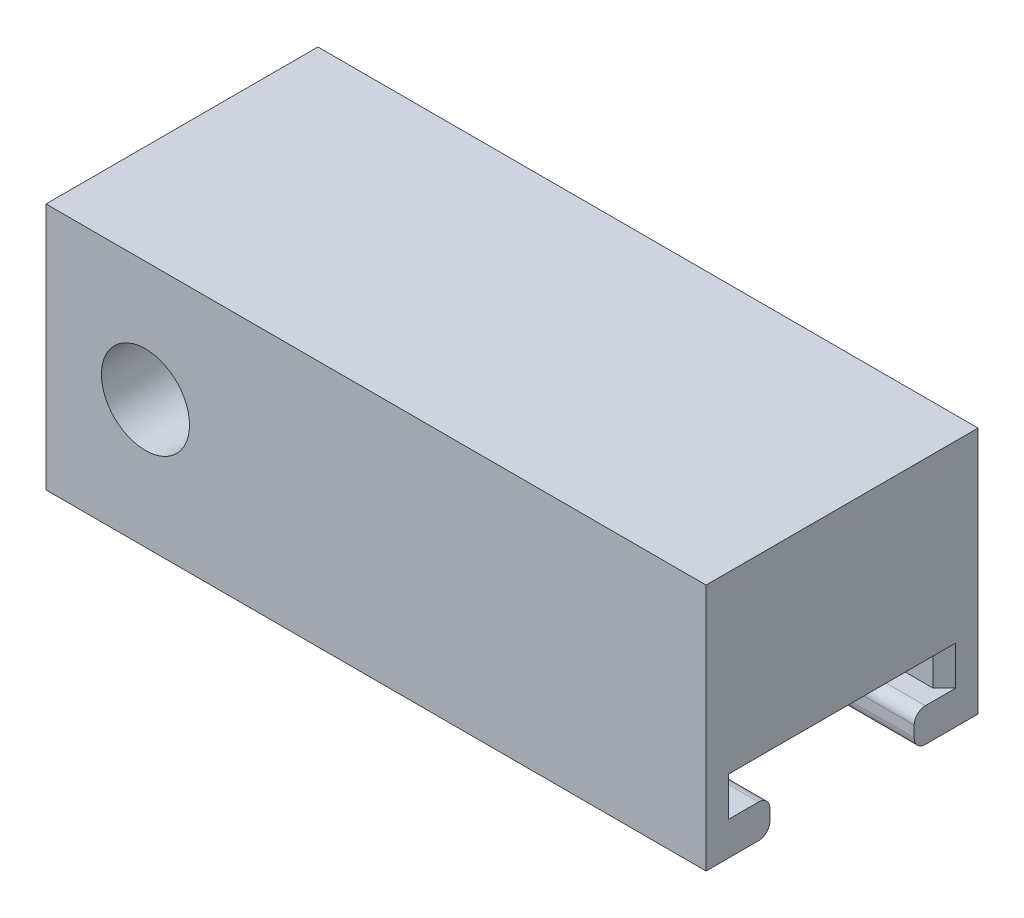
ISO-10303-21;
HEADER;
FILE_DESCRIPTION(('STEP AP214'),'2;1');
FILE_NAME('part.step','',(''),(''),'','','');
FILE_SCHEMA(('AUTOMOTIVE_DESIGN { 1 0 10303 214 1 1 1 1 }'));
ENDSEC;
DATA;
#1=APPLICATION_CONTEXT('core data for automotive mechanical design processes');
#2=APPLICATION_PROTOCOL_DEFINITION('international standard','automotive_design',2000,#1);
#3=PRODUCT_CONTEXT('',#1,'mechanical');
#4=PRODUCT('Part','Part','',(#3));
#5=PRODUCT_RELATED_PRODUCT_CATEGORY('part','',(#4));
#6=PRODUCT_DEFINITION_FORMATION('','',#4);
#7=PRODUCT_DEFINITION_CONTEXT('part definition',#1,'design');
#8=PRODUCT_DEFINITION('design','',#6,#7);
#9=PRODUCT_DEFINITION_SHAPE('','',#8);
#10=(LENGTH_UNIT() NAMED_UNIT(*) SI_UNIT(.MILLI.,.METRE.));
#11=(NAMED_UNIT(*) PLANE_ANGLE_UNIT() SI_UNIT($,.RADIAN.));
#12=(NAMED_UNIT(*) SI_UNIT($,.STERADIAN.) SOLID_ANGLE_UNIT());
#13=UNCERTAINTY_MEASURE_WITH_UNIT(LENGTH_MEASURE(1.E-05),#10,'distance_accuracy_value','');
#14=(GEOMETRIC_REPRESENTATION_CONTEXT(3) GLOBAL_UNCERTAINTY_ASSIGNED_CONTEXT((#13)) GLOBAL_UNIT_ASSIGNED_CONTEXT((#10,
#11,#12)) REPRESENTATION_CONTEXT('',''));
#15=CARTESIAN_POINT('',(0.,0.,0.));
#16=DIRECTION('',(0.,0.,1.));
#17=DIRECTION('',(1.,0.,0.));
#18=AXIS2_PLACEMENT_3D('',#15,#16,#17);
#19=CARTESIAN_POINT('',(11.,-0.46559494542915,3.));
#20=DIRECTION('',(0.,0.,-1.));
#21=DIRECTION('',(-1.,0.,0.));
#22=AXIS2_PLACEMENT_3D('',#19,#20,#21);
#23=CYLINDRICAL_SURFACE('',#22,3.49570965201632);
#24=CARTESIAN_POINT('',(11.,-0.46559494542915,-3.));
#25=DIRECTION('',(0.,0.,-1.));
#26=DIRECTION('',(-1.,0.,0.));
#27=AXIS2_PLACEMENT_3D('',#24,#25,#26);
#28=CIRCLE('',#27,3.49570965201632);
#29=CARTESIAN_POINT('',(13.47184,-2.93743494542916,-3.));
#30=VERTEX_POINT('',#29);
#31=CARTESIAN_POINT('',(8.52816,-2.93743494542916,-3.));
#32=VERTEX_POINT('',#31);
#33=EDGE_CURVE('E85',#30,#32,#28,.T.);
#34=ORIENTED_EDGE('',*,*,#33,.F.);
#35=DIRECTION('',(0.,0.,-1.));
#36=VECTOR('',#35,1.);
#37=CARTESIAN_POINT('',(13.47184,-2.93743494542916,3.));
#38=LINE('',#37,#36);
#39=CARTESIAN_POINT('',(13.47184,-2.93743494542916,3.));
#40=VERTEX_POINT('',#39);
#41=EDGE_CURVE('E12',#40,#30,#38,.T.);
#42=ORIENTED_EDGE('',*,*,#41,.F.);
#43=CARTESIAN_POINT('',(11.,-0.46559494542915,3.));
#44=DIRECTION('',(0.,0.,-1.));
#45=DIRECTION('',(-1.,0.,0.));
#46=AXIS2_PLACEMENT_3D('',#43,#44,#45);
#47=CIRCLE('',#46,3.49570965201632);
#48=CARTESIAN_POINT('',(8.52816,-2.93743494542916,3.));
#49=VERTEX_POINT('',#48);
#50=EDGE_CURVE('E89',#40,#49,#47,.T.);
#51=ORIENTED_EDGE('',*,*,#50,.T.);
#52=DIRECTION('',(0.,0.,-1.));
#53=VECTOR('',#52,1.);
#54=CARTESIAN_POINT('',(8.52816,-2.93743494542916,3.));
#55=LINE('',#54,#53);
#56=EDGE_CURVE('E59',#49,#32,#55,.T.);
#57=ORIENTED_EDGE('',*,*,#56,.T.);
#58=EDGE_LOOP('',(#34,#42,#51,#57));
#59=FACE_BOUND('',#58,.T.);
#60=ADVANCED_FACE('F56',(#59),#23,.T.);
#61=CARTESIAN_POINT('',(8.52816,-2.93743494542916,3.));
#62=DIRECTION('',(0.,1.,0.));
#63=DIRECTION('',(-1.,0.,0.));
#64=AXIS2_PLACEMENT_3D('',#61,#62,#63);
#65=PLANE('',#64);
#66=DIRECTION('',(1.,0.,0.));
#67=VECTOR('',#66,1.);
#68=CARTESIAN_POINT('',(8.52816,-2.93743494542916,-3.));
#69=LINE('',#68,#67);
#70=EDGE_CURVE('E82',#32,#30,#69,.T.);
#71=ORIENTED_EDGE('',*,*,#70,.F.);
#72=ORIENTED_EDGE('',*,*,#56,.F.);
#73=DIRECTION('',(1.,0.,0.));
#74=VECTOR('',#73,1.);
#75=CARTESIAN_POINT('',(8.52816,-2.93743494542916,3.));
#76=LINE('',#75,#74);
#77=EDGE_CURVE('E84',#49,#40,#76,.T.);
#78=ORIENTED_EDGE('',*,*,#77,.T.);
#79=ORIENTED_EDGE('',*,*,#41,.T.);
#80=EDGE_LOOP('',(#71,#72,#78,#79));
#81=FACE_BOUND('',#80,.T.);
#82=ADVANCED_FACE('F80',(#81),#65,.T.);
#83=CARTESIAN_POINT('',(11.,-0.46559494542915,3.));
#84=DIRECTION('',(0.,0.,-1.));
#85=DIRECTION('',(-1.,0.,0.));
#86=AXIS2_PLACEMENT_3D('',#83,#84,#85);
#87=PLANE('',#86);
#88=ORIENTED_EDGE('',*,*,#50,.F.);
#89=ORIENTED_EDGE('',*,*,#77,.F.);
#90=EDGE_LOOP('',(#88,#89));
#91=FACE_BOUND('',#90,.T.);
#92=ADVANCED_FACE('F94',(#91),#87,.F.);
#93=CARTESIAN_POINT('',(11.,-0.46559494542915,-3.));
#94=DIRECTION('',(0.,0.,-1.));
#95=DIRECTION('',(-1.,0.,0.));
#96=AXIS2_PLACEMENT_3D('',#93,#94,#95);
#97=PLANE('',#96);
#98=ORIENTED_EDGE('',*,*,#33,.T.);
#99=ORIENTED_EDGE('',*,*,#70,.T.);
#100=EDGE_LOOP('',(#98,#99));
#101=FACE_BOUND('',#100,.T.);
#102=ADVANCED_FACE('F88',(#101),#97,.T.);
#103=CLOSED_SHELL('',(#60,#82,#92,#102));
#104=MANIFOLD_SOLID_BREP('B2',#103);
#105=CARTESIAN_POINT('',(59.,-6.43743494542916,-7.44806819473783));
#106=DIRECTION('',(0.,-1.,0.));
#107=DIRECTION('',(0.,0.,-1.));
#108=AXIS2_PLACEMENT_3D('',#105,#106,#107);
#109=PLANE('',#108);
#110=DIRECTION('',(0.,0.,-1.));
#111=VECTOR('',#110,1.);
#112=CARTESIAN_POINT('',(25.4,-6.43743494542916,-7.44806819473783));
#113=LINE('',#112,#111);
#114=CARTESIAN_POINT('',(25.4,-6.43743494542916,-7.44806819473783));
#115=VERTEX_POINT('',#114);
#116=CARTESIAN_POINT('',(25.4,-6.43743494542916,-9.1519321867319));
#117=VERTEX_POINT('',#116);
#118=EDGE_CURVE('E144',#115,#117,#113,.T.);
#119=ORIENTED_EDGE('',*,*,#118,.F.);
#120=DIRECTION('',(-1.,0.,0.));
#121=VECTOR('',#120,1.);
#122=CARTESIAN_POINT('',(59.,-6.43743494542916,-7.44806819473783));
#123=LINE('',#122,#121);
#124=CARTESIAN_POINT('',(59.,-6.43743494542916,-7.44806819473783));
#125=VERTEX_POINT('',#124);
#126=EDGE_CURVE('E469',#125,#115,#123,.T.);
#127=ORIENTED_EDGE('',*,*,#126,.F.);
#128=DIRECTION('',(0.,0.,1.));
#129=VECTOR('',#128,1.);
#130=CARTESIAN_POINT('',(59.,-6.43743494542916,-7.44806819473783));
#131=LINE('',#130,#129);
#132=CARTESIAN_POINT('',(59.,-6.43743494542916,-10.1519321867319));
#133=VERTEX_POINT('',#132);
#134=EDGE_CURVE('E435',#133,#125,#131,.T.);
#135=ORIENTED_EDGE('',*,*,#134,.F.);
#136=DIRECTION('',(-0.70710678118655,0.,0.707106781186545));
#137=VECTOR('',#136,1.);
#138=CARTESIAN_POINT('',(57.648068004003,-6.43743494542916,-8.80000019073488));
#139=LINE('',#138,#137);
#140=CARTESIAN_POINT('',(58.,-6.43743494542917,-9.1519321867319));
#141=VERTEX_POINT('',#140);
#142=EDGE_CURVE('E137',#133,#141,#139,.T.);
#143=ORIENTED_EDGE('',*,*,#142,.T.);
#144=DIRECTION('',(-1.,0.,0.));
#145=VECTOR('',#144,1.);
#146=CARTESIAN_POINT('',(0.,-6.43743494542916,-9.1519321867319));
#147=LINE('',#146,#145);
#148=EDGE_CURVE('E405',#141,#117,#147,.T.);
#149=ORIENTED_EDGE('',*,*,#148,.T.);
#150=EDGE_LOOP('',(#119,#127,#135,#143,#149));
#151=FACE_BOUND('',#150,.T.);
#152=ADVANCED_FACE('F128',(#151),#109,.F.);
#153=CARTESIAN_POINT('',(59.,-7.43743494542914,-7.44806819473783));
#154=DIRECTION('',(-1.,0.,0.));
#155=DIRECTION('',(0.,0.,1.));
#156=AXIS2_PLACEMENT_3D('',#153,#154,#155);
#157=CYLINDRICAL_SURFACE('',#156,0.999999999999982);
#158=CARTESIAN_POINT('',(25.4,-7.43743494542914,-7.44806819473783));
#159=DIRECTION('',(-1.,0.,0.));
#160=DIRECTION('',(0.,0.,1.));
#161=AXIS2_PLACEMENT_3D('',#158,#159,#160);
#162=CIRCLE('',#161,0.999999999999983);
#163=CARTESIAN_POINT('',(25.4,-7.43743494542914,-6.44806819473785));
#164=VERTEX_POINT('',#163);
#165=EDGE_CURVE('E314',#164,#115,#162,.T.);
#166=ORIENTED_EDGE('',*,*,#165,.F.);
#167=DIRECTION('',(-1.,0.,0.));
#168=VECTOR('',#167,1.);
#169=CARTESIAN_POINT('',(59.,-7.43743494542914,-6.44806819473785));
#170=LINE('',#169,#168);
#171=CARTESIAN_POINT('',(59.,-7.43743494542914,-6.44806819473785));
#172=VERTEX_POINT('',#171);
#173=EDGE_CURVE('E466',#172,#164,#170,.T.);
#174=ORIENTED_EDGE('',*,*,#173,.F.);
#175=CARTESIAN_POINT('',(59.,-7.43743494542914,-7.44806819473783));
#176=DIRECTION('',(1.,0.,0.));
#177=DIRECTION('',(0.,0.,1.));
#178=AXIS2_PLACEMENT_3D('',#175,#176,#177);
#179=CIRCLE('',#178,0.999999999999982);
#180=EDGE_CURVE('E437',#125,#172,#179,.T.);
#181=ORIENTED_EDGE('',*,*,#180,.F.);
#182=ORIENTED_EDGE('',*,*,#126,.T.);
#183=EDGE_LOOP('',(#166,#174,#181,#182));
#184=FACE_BOUND('',#183,.T.);
#185=ADVANCED_FACE('F537',(#184),#157,.T.);
#186=CARTESIAN_POINT('',(59.,-8.43743494525206,-6.44806819473785));
#187=DIRECTION('',(0.,0.,-1.));
#188=DIRECTION('',(-1.,0.,0.));
#189=AXIS2_PLACEMENT_3D('',#186,#187,#188);
#190=PLANE('',#189);
#191=DIRECTION('',(0.,1.,0.));
#192=VECTOR('',#191,1.);
#193=CARTESIAN_POINT('',(25.4,-7.43743494542914,-6.44806819473785));
#194=LINE('',#193,#192);
#195=CARTESIAN_POINT('',(25.4,-8.43743494525206,-6.44806819473785));
#196=VERTEX_POINT('',#195);
#197=EDGE_CURVE('E327',#196,#164,#194,.T.);
#198=ORIENTED_EDGE('',*,*,#197,.F.);
#199=DIRECTION('',(-1.,0.,0.));
#200=VECTOR('',#199,1.);
#201=CARTESIAN_POINT('',(59.,-8.43743494525206,-6.44806819473785));
#202=LINE('',#201,#200);
#203=CARTESIAN_POINT('',(59.,-8.43743494525206,-6.44806819473785));
#204=VERTEX_POINT('',#203);
#205=EDGE_CURVE('E463',#204,#196,#202,.T.);
#206=ORIENTED_EDGE('',*,*,#205,.F.);
#207=DIRECTION('',(0.,-1.,0.));
#208=VECTOR('',#207,1.);
#209=CARTESIAN_POINT('',(59.,-8.43743494525206,-6.44806819473785));
#210=LINE('',#209,#208);
#211=EDGE_CURVE('E439',#172,#204,#210,.T.);
#212=ORIENTED_EDGE('',*,*,#211,.F.);
#213=ORIENTED_EDGE('',*,*,#173,.T.);
#214=EDGE_LOOP('',(#198,#206,#212,#213));
#215=FACE_BOUND('',#214,.T.);
#216=ADVANCED_FACE('F533',(#215),#190,.F.);
#217=CARTESIAN_POINT('',(59.,-8.43743494525206,-7.44806819473793));
#218=DIRECTION('',(-1.,0.,0.));
#219=DIRECTION('',(0.,0.,1.));
#220=AXIS2_PLACEMENT_3D('',#217,#218,#219);
#221=CYLINDRICAL_SURFACE('',#220,1.00000000000008);
#222=CARTESIAN_POINT('',(25.4,-8.43743494525206,-7.44806819473793));
#223=DIRECTION('',(-1.,0.,0.));
#224=DIRECTION('',(0.,0.,1.));
#225=AXIS2_PLACEMENT_3D('',#222,#223,#224);
#226=CIRCLE('',#225,1.00000000000008);
#227=CARTESIAN_POINT('',(25.4,-9.43743494525214,-7.44806819473793));
#228=VERTEX_POINT('',#227);
#229=EDGE_CURVE('E325',#228,#196,#226,.T.);
#230=ORIENTED_EDGE('',*,*,#229,.F.);
#231=DIRECTION('',(-1.,0.,0.));
#232=VECTOR('',#231,1.);
#233=CARTESIAN_POINT('',(59.,-9.43743494525214,-7.44806819473793));
#234=LINE('',#233,#232);
#235=CARTESIAN_POINT('',(59.,-9.43743494525214,-7.44806819473793));
#236=VERTEX_POINT('',#235);
#237=EDGE_CURVE('E324',#236,#228,#234,.T.);
#238=ORIENTED_EDGE('',*,*,#237,.F.);
#239=CARTESIAN_POINT('',(59.,-8.43743494525206,-7.44806819473793));
#240=DIRECTION('',(1.,0.,0.));
#241=DIRECTION('',(0.,0.,1.));
#242=AXIS2_PLACEMENT_3D('',#239,#240,#241);
#243=CIRCLE('',#242,1.00000000000008);
#244=EDGE_CURVE('E441',#204,#236,#243,.T.);
#245=ORIENTED_EDGE('',*,*,#244,.F.);
#246=ORIENTED_EDGE('',*,*,#205,.T.);
#247=EDGE_LOOP('',(#230,#238,#245,#246));
#248=FACE_BOUND('',#247,.T.);
#249=ADVANCED_FACE('F529',(#248),#221,.T.);
#250=CARTESIAN_POINT('',(59.,-9.43743494542915,12.1519321867319));
#251=DIRECTION('',(0.,0.,-1.));
#252=DIRECTION('',(-1.,0.,0.));
#253=AXIS2_PLACEMENT_3D('',#250,#251,#252);
#254=PLANE('',#253);
#255=CARTESIAN_POINT('',(8.88999999999999,1.99694504352777,12.1519321867319));
#256=DIRECTION('',(0.,0.,1.));
#257=DIRECTION('',(1.,0.,0.));
#258=AXIS2_PLACEMENT_3D('',#255,#256,#257);
#259=CIRCLE('',#258,3.93699999999998);
#260=CARTESIAN_POINT('',(12.827,1.99694504352777,12.1519321867319));
#261=VERTEX_POINT('',#260);
#262=EDGE_CURVE('E352',#261,#261,#259,.T.);
#263=ORIENTED_EDGE('',*,*,#262,.F.);
#264=EDGE_LOOP('',(#263));
#265=FACE_BOUND('',#264,.T.);
#266=DIRECTION('',(0.,-1.,0.));
#267=VECTOR('',#266,1.);
#268=CARTESIAN_POINT('',(0.,-9.43743494542915,12.1519321867319));
#269=LINE('',#268,#267);
#270=CARTESIAN_POINT('',(0.,12.7,12.1519321867319));
#271=VERTEX_POINT('',#270);
#272=CARTESIAN_POINT('',(0.,-9.43743494542915,12.1519321867319));
#273=VERTEX_POINT('',#272);
#274=EDGE_CURVE('E419',#271,#273,#269,.T.);
#275=ORIENTED_EDGE('',*,*,#274,.T.);
#276=DIRECTION('',(-1.,0.,0.));
#277=VECTOR('',#276,1.);
#278=CARTESIAN_POINT('',(59.,-9.43743494542915,12.1519321867319));
#279=LINE('',#278,#277);
#280=CARTESIAN_POINT('',(59.,-9.43743494542915,12.1519321867319));
#281=VERTEX_POINT('',#280);
#282=EDGE_CURVE('E484',#281,#273,#279,.T.);
#283=ORIENTED_EDGE('',*,*,#282,.F.);
#284=DIRECTION('',(0.,-1.,0.));
#285=VECTOR('',#284,1.);
#286=CARTESIAN_POINT('',(59.,-9.43743494542915,12.1519321867319));
#287=LINE('',#286,#285);
#288=CARTESIAN_POINT('',(59.,12.7,12.1519321867319));
#289=VERTEX_POINT('',#288);
#290=EDGE_CURVE('E420',#289,#281,#287,.T.);
#291=ORIENTED_EDGE('',*,*,#290,.F.);
#292=DIRECTION('',(1.,0.,0.));
#293=VECTOR('',#292,1.);
#294=CARTESIAN_POINT('',(0.,12.7,12.1519321867319));
#295=LINE('',#294,#293);
#296=EDGE_CURVE('E391',#271,#289,#295,.T.);
#297=ORIENTED_EDGE('',*,*,#296,.F.);
#298=EDGE_LOOP('',(#275,#283,#291,#297));
#299=FACE_BOUND('',#298,.T.);
#300=ADVANCED_FACE('F559',(#265,#299),#254,.F.);
#301=CARTESIAN_POINT('',(59.,-9.43743494542915,7.4519319006296));
#302=DIRECTION('',(0.,1.,0.));
#303=DIRECTION('',(0.,0.,1.));
#304=AXIS2_PLACEMENT_3D('',#301,#302,#303);
#305=PLANE('',#304);
#306=DIRECTION('',(0.,0.,-1.));
#307=VECTOR('',#306,1.);
#308=CARTESIAN_POINT('',(0.,-9.43743494542915,7.4519319006296));
#309=LINE('',#308,#307);
#310=CARTESIAN_POINT('',(0.,-9.43743494525214,9.1519321867319));
#311=VERTEX_POINT('',#310);
#312=EDGE_CURVE('E449',#273,#311,#309,.T.);
#313=ORIENTED_EDGE('',*,*,#312,.T.);
#314=DIRECTION('',(-1.,0.,0.));
#315=VECTOR('',#314,1.);
#316=CARTESIAN_POINT('',(25.4,-9.43743494525214,9.1519321867319));
#317=LINE('',#316,#315);
#318=CARTESIAN_POINT('',(25.4,-9.43743494525214,9.1519321867319));
#319=VERTEX_POINT('',#318);
#320=EDGE_CURVE('E333',#319,#311,#317,.T.);
#321=ORIENTED_EDGE('',*,*,#320,.F.);
#322=DIRECTION('',(0.,0.,1.));
#323=VECTOR('',#322,1.);
#324=CARTESIAN_POINT('',(25.4,-9.43743494525214,9.1519321867319));
#325=LINE('',#324,#323);
#326=CARTESIAN_POINT('',(25.4,-9.43743494525214,7.4519319006296));
#327=VERTEX_POINT('',#326);
#328=EDGE_CURVE('E341',#327,#319,#325,.T.);
#329=ORIENTED_EDGE('',*,*,#328,.F.);
#330=DIRECTION('',(-1.,0.,0.));
#331=VECTOR('',#330,1.);
#332=CARTESIAN_POINT('',(59.,-9.43743494542915,7.4519319006296));
#333=LINE('',#332,#331);
#334=CARTESIAN_POINT('',(59.,-9.43743494542915,7.4519319006296));
#335=VERTEX_POINT('',#334);
#336=EDGE_CURVE('E481',#335,#327,#333,.T.);
#337=ORIENTED_EDGE('',*,*,#336,.F.);
#338=DIRECTION('',(0.,0.,-1.));
#339=VECTOR('',#338,1.);
#340=CARTESIAN_POINT('',(59.,-9.43743494542915,7.4519319006296));
#341=LINE('',#340,#339);
#342=EDGE_CURVE('E422',#281,#335,#341,.T.);
#343=ORIENTED_EDGE('',*,*,#342,.F.);
#344=ORIENTED_EDGE('',*,*,#282,.T.);
#345=EDGE_LOOP('',(#313,#321,#329,#337,#343,#344));
#346=FACE_BOUND('',#345,.T.);
#347=ADVANCED_FACE('F553',(#346),#305,.F.);
#348=CARTESIAN_POINT('',(59.,-8.43743494542916,7.4519319006296));
#349=DIRECTION('',(-1.,0.,0.));
#350=DIRECTION('',(0.,0.,1.));
#351=AXIS2_PLACEMENT_3D('',#348,#349,#350);
#352=CYLINDRICAL_SURFACE('',#351,0.999999999999995);
#353=CARTESIAN_POINT('',(25.4,-9.43743494525214,7.44806819473793));
#354=VERTEX_POINT('',#353);
#355=EDGE_CURVE('E342',#354,#327,#325,.T.);
#356=ORIENTED_EDGE('',*,*,#355,.F.);
#357=CARTESIAN_POINT('',(25.4,-8.43743494542916,7.4519319006296));
#358=DIRECTION('',(1.,0.,0.));
#359=DIRECTION('',(0.,0.,-1.));
#360=AXIS2_PLACEMENT_3D('',#357,#358,#359);
#361=CIRCLE('',#360,0.999999999999995);
#362=CARTESIAN_POINT('',(25.4,-8.43743494542916,6.4519319006296));
#363=VERTEX_POINT('',#362);
#364=EDGE_CURVE('E349',#354,#363,#361,.T.);
#365=ORIENTED_EDGE('',*,*,#364,.T.);
#366=DIRECTION('',(-1.,0.,0.));
#367=VECTOR('',#366,1.);
#368=CARTESIAN_POINT('',(59.,-8.43743494542916,6.4519319006296));
#369=LINE('',#368,#367);
#370=CARTESIAN_POINT('',(59.,-8.43743494542916,6.4519319006296));
#371=VERTEX_POINT('',#370);
#372=EDGE_CURVE('E478',#371,#363,#369,.T.);
#373=ORIENTED_EDGE('',*,*,#372,.F.);
#374=CARTESIAN_POINT('',(59.,-8.43743494542916,7.4519319006296));
#375=DIRECTION('',(1.,0.,0.));
#376=DIRECTION('',(0.,0.,1.));
#377=AXIS2_PLACEMENT_3D('',#374,#375,#376);
#378=CIRCLE('',#377,0.999999999999995);
#379=EDGE_CURVE('E425',#335,#371,#378,.T.);
#380=ORIENTED_EDGE('',*,*,#379,.F.);
#381=ORIENTED_EDGE('',*,*,#336,.T.);
#382=EDGE_LOOP('',(#356,#365,#373,#380,#381));
#383=FACE_BOUND('',#382,.T.);
#384=ADVANCED_FACE('F599',(#383),#352,.T.);
#385=CARTESIAN_POINT('',(59.,-7.43743494542916,6.4519319006296));
#386=DIRECTION('',(0.,0.,1.));
#387=DIRECTION('',(1.,0.,0.));
#388=AXIS2_PLACEMENT_3D('',#385,#386,#387);
#389=PLANE('',#388);
#390=ORIENTED_EDGE('',*,*,#372,.T.);
#391=DIRECTION('',(0.,1.,0.));
#392=VECTOR('',#391,1.);
#393=CARTESIAN_POINT('',(25.4,-7.43743494542916,6.4519319006296));
#394=LINE('',#393,#392);
#395=CARTESIAN_POINT('',(25.4,-7.43743494542916,6.4519319006296));
#396=VERTEX_POINT('',#395);
#397=EDGE_CURVE('E346',#363,#396,#394,.T.);
#398=ORIENTED_EDGE('',*,*,#397,.T.);
#399=DIRECTION('',(-1.,0.,0.));
#400=VECTOR('',#399,1.);
#401=CARTESIAN_POINT('',(59.,-7.43743494542916,6.4519319006296));
#402=LINE('',#401,#400);
#403=CARTESIAN_POINT('',(59.,-7.43743494542916,6.4519319006296));
#404=VERTEX_POINT('',#403);
#405=EDGE_CURVE('E475',#404,#396,#402,.T.);
#406=ORIENTED_EDGE('',*,*,#405,.F.);
#407=DIRECTION('',(0.,1.,0.));
#408=VECTOR('',#407,1.);
#409=CARTESIAN_POINT('',(59.,-7.43743494542916,6.4519319006296));
#410=LINE('',#409,#408);
#411=EDGE_CURVE('E427',#371,#404,#410,.T.);
#412=ORIENTED_EDGE('',*,*,#411,.F.);
#413=EDGE_LOOP('',(#390,#398,#406,#412));
#414=FACE_BOUND('',#413,.T.);
#415=ADVANCED_FACE('F595',(#414),#389,.F.);
#416=CARTESIAN_POINT('',(59.,-7.43743494542916,7.4519319006296));
#417=DIRECTION('',(-1.,0.,0.));
#418=DIRECTION('',(0.,0.,1.));
#419=AXIS2_PLACEMENT_3D('',#416,#417,#418);
#420=CYLINDRICAL_SURFACE('',#419,0.999999999999997);
#421=CARTESIAN_POINT('',(25.4,-7.43743494542916,7.4519319006296));
#422=DIRECTION('',(1.,0.,0.));
#423=DIRECTION('',(0.,0.,-1.));
#424=AXIS2_PLACEMENT_3D('',#421,#422,#423);
#425=CIRCLE('',#424,0.999999999999997);
#426=CARTESIAN_POINT('',(25.4,-6.43743494542916,7.44806819473783));
#427=VERTEX_POINT('',#426);
#428=EDGE_CURVE('E313',#396,#427,#425,.T.);
#429=ORIENTED_EDGE('',*,*,#428,.T.);
#430=DIRECTION('',(0.,0.,-1.));
#431=VECTOR('',#430,1.);
#432=CARTESIAN_POINT('',(25.4,-6.43743494542916,7.44806819473783));
#433=LINE('',#432,#431);
#434=CARTESIAN_POINT('',(25.4,-6.43743494542916,7.4519319006296));
#435=VERTEX_POINT('',#434);
#436=EDGE_CURVE('E336',#435,#427,#433,.T.);
#437=ORIENTED_EDGE('',*,*,#436,.F.);
#438=DIRECTION('',(-1.,0.,0.));
#439=VECTOR('',#438,1.);
#440=CARTESIAN_POINT('',(59.,-6.43743494542916,7.4519319006296));
#441=LINE('',#440,#439);
#442=CARTESIAN_POINT('',(59.,-6.43743494542916,7.4519319006296));
#443=VERTEX_POINT('',#442);
#444=EDGE_CURVE('E472',#443,#435,#441,.T.);
#445=ORIENTED_EDGE('',*,*,#444,.F.);
#446=CARTESIAN_POINT('',(59.,-7.43743494542916,7.4519319006296));
#447=DIRECTION('',(1.,0.,0.));
#448=DIRECTION('',(0.,0.,1.));
#449=AXIS2_PLACEMENT_3D('',#446,#447,#448);
#450=CIRCLE('',#449,0.999999999999997);
#451=EDGE_CURVE('E429',#404,#443,#450,.T.);
#452=ORIENTED_EDGE('',*,*,#451,.F.);
#453=ORIENTED_EDGE('',*,*,#405,.T.);
#454=EDGE_LOOP('',(#429,#437,#445,#452,#453));
#455=FACE_BOUND('',#454,.T.);
#456=ADVANCED_FACE('F591',(#455),#420,.T.);
#457=CARTESIAN_POINT('',(59.,-6.43743494542916,10.1519321867319));
#458=DIRECTION('',(0.,-1.,0.));
#459=DIRECTION('',(0.,0.,-1.));
#460=AXIS2_PLACEMENT_3D('',#457,#458,#459);
#461=PLANE('',#460);
#462=ORIENTED_EDGE('',*,*,#444,.T.);
#463=CARTESIAN_POINT('',(25.4,-6.43743494542916,9.1519321867319));
#464=VERTEX_POINT('',#463);
#465=EDGE_CURVE('E337',#464,#435,#433,.T.);
#466=ORIENTED_EDGE('',*,*,#465,.F.);
#467=DIRECTION('',(-1.,0.,0.));
#468=VECTOR('',#467,1.);
#469=CARTESIAN_POINT('',(0.,-6.43743494542916,9.1519321867319));
#470=LINE('',#469,#468);
#471=CARTESIAN_POINT('',(58.,-6.43743494542917,9.1519321867319));
#472=VERTEX_POINT('',#471);
#473=EDGE_CURVE('E416',#472,#464,#470,.T.);
#474=ORIENTED_EDGE('',*,*,#473,.F.);
#475=DIRECTION('',(0.707106781186548,0.,0.707106781186547));
#476=VECTOR('',#475,1.);
#477=CARTESIAN_POINT('',(59.,-6.43743494542916,10.1519321867319));
#478=LINE('',#477,#476);
#479=CARTESIAN_POINT('',(59.,-6.43743494542916,10.1519321867319));
#480=VERTEX_POINT('',#479);
#481=EDGE_CURVE('E493',#472,#480,#478,.T.);
#482=ORIENTED_EDGE('',*,*,#481,.T.);
#483=DIRECTION('',(0.,0.,1.));
#484=VECTOR('',#483,1.);
#485=CARTESIAN_POINT('',(59.,-6.43743494542916,10.1519321867319));
#486=LINE('',#485,#484);
#487=EDGE_CURVE('E431',#443,#480,#486,.T.);
#488=ORIENTED_EDGE('',*,*,#487,.F.);
#489=EDGE_LOOP('',(#462,#466,#474,#482,#488));
#490=FACE_BOUND('',#489,.T.);
#491=ADVANCED_FACE('F588',(#490),#461,.F.);
#492=CARTESIAN_POINT('',(59.,-2.93743494542916,-10.148068004003));
#493=DIRECTION('',(0.,1.,0.));
#494=DIRECTION('',(0.,0.,1.));
#495=AXIS2_PLACEMENT_3D('',#492,#493,#494);
#496=PLANE('',#495);
#497=DIRECTION('',(0.,0.,-1.));
#498=VECTOR('',#497,1.);
#499=CARTESIAN_POINT('',(0.,-2.93743494542916,-10.148068004003));
#500=LINE('',#499,#498);
#501=CARTESIAN_POINT('',(0.,-2.93743494542916,9.1519321867319));
#502=VERTEX_POINT('',#501);
#503=CARTESIAN_POINT('',(0.,-2.93743494542916,-9.1519321867319));
#504=VERTEX_POINT('',#503);
#505=EDGE_CURVE('E452',#502,#504,#500,.T.);
#506=ORIENTED_EDGE('',*,*,#505,.T.);
#507=DIRECTION('',(1.,0.,0.));
#508=VECTOR('',#507,1.);
#509=CARTESIAN_POINT('',(0.,-2.93743494542915,-9.1519321867319));
#510=LINE('',#509,#508);
#511=CARTESIAN_POINT('',(58.,-2.93743494542916,-9.1519321867319));
#512=VERTEX_POINT('',#511);
#513=EDGE_CURVE('E407',#504,#512,#510,.T.);
#514=ORIENTED_EDGE('',*,*,#513,.T.);
#515=DIRECTION('',(0.70710678118655,0.,-0.707106781186545));
#516=VECTOR('',#515,1.);
#517=CARTESIAN_POINT('',(58.9980679086355,-2.93743494542916,-10.1500000953674));
#518=LINE('',#517,#516);
#519=CARTESIAN_POINT('',(59.,-2.93743494542916,-10.1519321867319));
#520=VERTEX_POINT('',#519);
#521=EDGE_CURVE('E54',#512,#520,#518,.T.);
#522=ORIENTED_EDGE('',*,*,#521,.T.);
#523=DIRECTION('',(0.,0.,-1.));
#524=VECTOR('',#523,1.);
#525=CARTESIAN_POINT('',(59.,-2.93743494542916,-10.148068004003));
#526=LINE('',#525,#524);
#527=CARTESIAN_POINT('',(59.,-2.93743494542916,10.1519321867319));
#528=VERTEX_POINT('',#527);
#529=EDGE_CURVE('E433',#528,#520,#526,.T.);
#530=ORIENTED_EDGE('',*,*,#529,.F.);
#531=DIRECTION('',(-0.707106781186548,0.,-0.707106781186547));
#532=VECTOR('',#531,1.);
#533=CARTESIAN_POINT('',(48.8499999046326,-2.93743494542916,0.00193209136448158));
#534=LINE('',#533,#532);
#535=CARTESIAN_POINT('',(58.,-2.93743494542916,9.1519321867319));
#536=VERTEX_POINT('',#535);
#537=EDGE_CURVE('E496',#528,#536,#534,.T.);
#538=ORIENTED_EDGE('',*,*,#537,.T.);
#539=DIRECTION('',(1.,0.,0.));
#540=VECTOR('',#539,1.);
#541=CARTESIAN_POINT('',(0.,-2.93743494542915,9.1519321867319));
#542=LINE('',#541,#540);
#543=EDGE_CURVE('E413',#502,#536,#542,.T.);
#544=ORIENTED_EDGE('',*,*,#543,.F.);
#545=EDGE_LOOP('',(#506,#514,#522,#530,#538,#544));
#546=FACE_BOUND('',#545,.T.);
#547=ADVANCED_FACE('F510',(#546),#496,.F.);
#548=CARTESIAN_POINT('',(59.,-9.43743494525215,-12.148068004003));
#549=DIRECTION('',(0.,1.,0.));
#550=DIRECTION('',(0.,0.,1.));
#551=AXIS2_PLACEMENT_3D('',#548,#549,#550);
#552=PLANE('',#551);
#553=DIRECTION('',(0.,0.,1.));
#554=VECTOR('',#553,1.);
#555=CARTESIAN_POINT('',(25.4,-9.43743494525214,-9.1519321867319));
#556=LINE('',#555,#554);
#557=CARTESIAN_POINT('',(25.4,-9.43743494525214,-9.1519321867319));
#558=VERTEX_POINT('',#557);
#559=EDGE_CURVE('E317',#558,#228,#556,.T.);
#560=ORIENTED_EDGE('',*,*,#559,.F.);
#561=DIRECTION('',(-1.,0.,0.));
#562=VECTOR('',#561,1.);
#563=CARTESIAN_POINT('',(25.4,-9.43743494525214,-9.1519321867319));
#564=LINE('',#563,#562);
#565=CARTESIAN_POINT('',(0.,-9.43743494525214,-9.1519321867319));
#566=VERTEX_POINT('',#565);
#567=EDGE_CURVE('E302',#558,#566,#564,.T.);
#568=ORIENTED_EDGE('',*,*,#567,.T.);
#569=DIRECTION('',(0.,0.,-1.));
#570=VECTOR('',#569,1.);
#571=CARTESIAN_POINT('',(0.,-9.43743494525215,-12.148068004003));
#572=LINE('',#571,#570);
#573=CARTESIAN_POINT('',(0.,-9.43743494525215,-12.148068004003));
#574=VERTEX_POINT('',#573);
#575=EDGE_CURVE('E454',#566,#574,#572,.T.);
#576=ORIENTED_EDGE('',*,*,#575,.T.);
#577=DIRECTION('',(-1.,0.,0.));
#578=VECTOR('',#577,1.);
#579=CARTESIAN_POINT('',(59.,-9.43743494525215,-12.148068004003));
#580=LINE('',#579,#578);
#581=CARTESIAN_POINT('',(59.,-9.43743494525215,-12.148068004003));
#582=VERTEX_POINT('',#581);
#583=EDGE_CURVE('E459',#582,#574,#580,.T.);
#584=ORIENTED_EDGE('',*,*,#583,.F.);
#585=DIRECTION('',(0.,0.,-1.));
#586=VECTOR('',#585,1.);
#587=CARTESIAN_POINT('',(59.,-9.43743494525215,-12.148068004003));
#588=LINE('',#587,#586);
#589=EDGE_CURVE('E443',#236,#582,#588,.T.);
#590=ORIENTED_EDGE('',*,*,#589,.F.);
#591=ORIENTED_EDGE('',*,*,#237,.T.);
#592=EDGE_LOOP('',(#560,#568,#576,#584,#590,#591));
#593=FACE_BOUND('',#592,.T.);
#594=ADVANCED_FACE('F321',(#593),#552,.F.);
#595=CARTESIAN_POINT('',(59.,0.,-12.1519321867319));
#596=DIRECTION('',(0.,0.00040945261370363,0.999999916174275));
#597=DIRECTION('',(0.,-0.999999916174275,0.00040945261370363));
#598=AXIS2_PLACEMENT_3D('',#595,#596,#597);
#599=PLANE('',#598);
#600=DIRECTION('',(0.,0.999999916174275,-0.00040945261370363));
#601=VECTOR('',#600,1.);
#602=CARTESIAN_POINT('',(0.,0.,-12.1519321867319));
#603=LINE('',#602,#601);
#604=CARTESIAN_POINT('',(0.,0.,-12.1519321867319));
#605=VERTEX_POINT('',#604);
#606=EDGE_CURVE('E423',#574,#605,#603,.T.);
#607=ORIENTED_EDGE('',*,*,#606,.T.);
#608=DIRECTION('',(-1.,0.,0.));
#609=VECTOR('',#608,1.);
#610=CARTESIAN_POINT('',(59.,0.,-12.1519321867319));
#611=LINE('',#610,#609);
#612=CARTESIAN_POINT('',(59.,0.,-12.1519321867319));
#613=VERTEX_POINT('',#612);
#614=EDGE_CURVE('E447',#613,#605,#611,.T.);
#615=ORIENTED_EDGE('',*,*,#614,.F.);
#616=DIRECTION('',(0.,0.999999916174275,-0.00040945261370363));
#617=VECTOR('',#616,1.);
#618=CARTESIAN_POINT('',(59.,0.,-12.1519321867319));
#619=LINE('',#618,#617);
#620=EDGE_CURVE('E445',#582,#613,#619,.T.);
#621=ORIENTED_EDGE('',*,*,#620,.F.);
#622=ORIENTED_EDGE('',*,*,#583,.T.);
#623=EDGE_LOOP('',(#607,#615,#621,#622));
#624=FACE_BOUND('',#623,.T.);
#625=ADVANCED_FACE('F518',(#624),#599,.F.);
#626=CARTESIAN_POINT('',(59.,-8.43743494525206,-7.44806819473793));
#627=DIRECTION('',(-1.,0.,0.));
#628=DIRECTION('',(0.,0.,1.));
#629=AXIS2_PLACEMENT_3D('',#626,#627,#628);
#630=PLANE('',#629);
#631=DIRECTION('',(0.,-1.,0.));
#632=VECTOR('',#631,1.);
#633=CARTESIAN_POINT('',(59.,-6.43743494542916,-10.1519321867319));
#634=LINE('',#633,#632);
#635=EDGE_CURVE('E498',#520,#133,#634,.T.);
#636=ORIENTED_EDGE('',*,*,#635,.T.);
#637=ORIENTED_EDGE('',*,*,#134,.T.);
#638=ORIENTED_EDGE('',*,*,#180,.T.);
#639=ORIENTED_EDGE('',*,*,#211,.T.);
#640=ORIENTED_EDGE('',*,*,#244,.T.);
#641=ORIENTED_EDGE('',*,*,#589,.T.);
#642=ORIENTED_EDGE('',*,*,#620,.T.);
#643=DIRECTION('',(0.,-1.,0.));
#644=VECTOR('',#643,1.);
#645=CARTESIAN_POINT('',(59.,12.7,-12.1519321867319));
#646=LINE('',#645,#644);
#647=CARTESIAN_POINT('',(59.,12.7,-12.1519321867319));
#648=VERTEX_POINT('',#647);
#649=EDGE_CURVE('E401',#648,#613,#646,.T.);
#650=ORIENTED_EDGE('',*,*,#649,.F.);
#651=DIRECTION('',(0.,0.,-1.));
#652=VECTOR('',#651,1.);
#653=CARTESIAN_POINT('',(59.,12.7,-12.1519321867319));
#654=LINE('',#653,#652);
#655=EDGE_CURVE('E394',#289,#648,#654,.T.);
#656=ORIENTED_EDGE('',*,*,#655,.F.);
#657=ORIENTED_EDGE('',*,*,#290,.T.);
#658=ORIENTED_EDGE('',*,*,#342,.T.);
#659=ORIENTED_EDGE('',*,*,#379,.T.);
#660=ORIENTED_EDGE('',*,*,#411,.T.);
#661=ORIENTED_EDGE('',*,*,#451,.T.);
#662=ORIENTED_EDGE('',*,*,#487,.T.);
#663=DIRECTION('',(0.,1.,0.));
#664=VECTOR('',#663,1.);
#665=CARTESIAN_POINT('',(59.,-2.93743494542916,10.1519321867319));
#666=LINE('',#665,#664);
#667=EDGE_CURVE('E490',#480,#528,#666,.T.);
#668=ORIENTED_EDGE('',*,*,#667,.T.);
#669=ORIENTED_EDGE('',*,*,#529,.T.);
#670=EDGE_LOOP('',(#636,#637,#638,#639,#640,#641,#642,#650,#656,#657,#658,#659,#660,#661,#662,
#668,#669));
#671=FACE_BOUND('',#670,.T.);
#672=ADVANCED_FACE('F522',(#671),#630,.F.);
#673=CARTESIAN_POINT('',(0.,-8.43743494525206,-7.44806819473793));
#674=DIRECTION('',(-1.,0.,0.));
#675=DIRECTION('',(0.,0.,1.));
#676=AXIS2_PLACEMENT_3D('',#673,#674,#675);
#677=PLANE('',#676);
#678=ORIENTED_EDGE('',*,*,#575,.F.);
#679=DIRECTION('',(0.,1.,0.));
#680=VECTOR('',#679,1.);
#681=CARTESIAN_POINT('',(0.,-6.43743494542916,-9.1519321867319));
#682=LINE('',#681,#680);
#683=EDGE_CURVE('E309',#566,#504,#682,.T.);
#684=ORIENTED_EDGE('',*,*,#683,.T.);
#685=ORIENTED_EDGE('',*,*,#505,.F.);
#686=DIRECTION('',(0.,1.,0.));
#687=VECTOR('',#686,1.);
#688=CARTESIAN_POINT('',(0.,-6.43743494542916,9.1519321867319));
#689=LINE('',#688,#687);
#690=EDGE_CURVE('E410',#311,#502,#689,.T.);
#691=ORIENTED_EDGE('',*,*,#690,.F.);
#692=ORIENTED_EDGE('',*,*,#312,.F.);
#693=ORIENTED_EDGE('',*,*,#274,.F.);
#694=DIRECTION('',(0.,0.,1.));
#695=VECTOR('',#694,1.);
#696=CARTESIAN_POINT('',(0.,12.7,-12.1519321867319));
#697=LINE('',#696,#695);
#698=CARTESIAN_POINT('',(0.,12.7,-12.1519321867319));
#699=VERTEX_POINT('',#698);
#700=EDGE_CURVE('E383',#699,#271,#697,.T.);
#701=ORIENTED_EDGE('',*,*,#700,.F.);
#702=DIRECTION('',(0.,-1.,0.));
#703=VECTOR('',#702,1.);
#704=CARTESIAN_POINT('',(0.,12.7,-12.1519321867319));
#705=LINE('',#704,#703);
#706=EDGE_CURVE('E398',#699,#605,#705,.T.);
#707=ORIENTED_EDGE('',*,*,#706,.T.);
#708=ORIENTED_EDGE('',*,*,#606,.F.);
#709=EDGE_LOOP('',(#678,#684,#685,#691,#692,#693,#701,#707,#708));
#710=FACE_BOUND('',#709,.T.);
#711=ADVANCED_FACE('F513',(#710),#677,.T.);
#712=CARTESIAN_POINT('',(0.,0.,9.1519321867319));
#713=DIRECTION('',(0.,0.,-1.));
#714=DIRECTION('',(-1.,0.,0.));
#715=AXIS2_PLACEMENT_3D('',#712,#713,#714);
#716=PLANE('',#715);
#717=ORIENTED_EDGE('',*,*,#543,.T.);
#718=DIRECTION('',(0.,-1.,0.));
#719=VECTOR('',#718,1.);
#720=CARTESIAN_POINT('',(58.,-6.43743494542916,9.1519321867319));
#721=LINE('',#720,#719);
#722=EDGE_CURVE('E487',#536,#472,#721,.T.);
#723=ORIENTED_EDGE('',*,*,#722,.T.);
#724=ORIENTED_EDGE('',*,*,#473,.T.);
#725=DIRECTION('',(0.,1.,0.));
#726=VECTOR('',#725,1.);
#727=CARTESIAN_POINT('',(25.4,-6.43743494542916,9.1519321867319));
#728=LINE('',#727,#726);
#729=EDGE_CURVE('E339',#319,#464,#728,.T.);
#730=ORIENTED_EDGE('',*,*,#729,.F.);
#731=ORIENTED_EDGE('',*,*,#320,.T.);
#732=ORIENTED_EDGE('',*,*,#690,.T.);
#733=EDGE_LOOP('',(#717,#723,#724,#730,#731,#732));
#734=FACE_BOUND('',#733,.T.);
#735=ADVANCED_FACE('F545',(#734),#716,.T.);
#736=CARTESIAN_POINT('',(58.,0.,9.1519321867319));
#737=DIRECTION('',(0.707106781186547,0.,-0.707106781186548));
#738=DIRECTION('',(0.,1.,0.));
#739=AXIS2_PLACEMENT_3D('',#736,#737,#738);
#740=PLANE('',#739);
#741=ORIENTED_EDGE('',*,*,#537,.F.);
#742=ORIENTED_EDGE('',*,*,#667,.F.);
#743=ORIENTED_EDGE('',*,*,#481,.F.);
#744=ORIENTED_EDGE('',*,*,#722,.F.);
#745=EDGE_LOOP('',(#741,#742,#743,#744));
#746=FACE_BOUND('',#745,.T.);
#747=ADVANCED_FACE('F543',(#746),#740,.T.);
#748=CARTESIAN_POINT('',(0.,0.,-9.1519321867319));
#749=DIRECTION('',(0.,0.,1.));
#750=DIRECTION('',(-1.,0.,0.));
#751=AXIS2_PLACEMENT_3D('',#748,#749,#750);
#752=PLANE('',#751);
#753=ORIENTED_EDGE('',*,*,#148,.F.);
#754=DIRECTION('',(0.,1.,0.));
#755=VECTOR('',#754,1.);
#756=CARTESIAN_POINT('',(58.,-2.93743494542916,-9.1519321867319));
#757=LINE('',#756,#755);
#758=EDGE_CURVE('E501',#141,#512,#757,.T.);
#759=ORIENTED_EDGE('',*,*,#758,.T.);
#760=ORIENTED_EDGE('',*,*,#513,.F.);
#761=ORIENTED_EDGE('',*,*,#683,.F.);
#762=ORIENTED_EDGE('',*,*,#567,.F.);
#763=DIRECTION('',(0.,-1.,0.));
#764=VECTOR('',#763,1.);
#765=CARTESIAN_POINT('',(25.4,-6.43743494542916,-9.1519321867319));
#766=LINE('',#765,#764);
#767=EDGE_CURVE('E305',#117,#558,#766,.T.);
#768=ORIENTED_EDGE('',*,*,#767,.F.);
#769=EDGE_LOOP('',(#753,#759,#760,#761,#762,#768));
#770=FACE_BOUND('',#769,.T.);
#771=ADVANCED_FACE('F304',(#770),#752,.T.);
#772=CARTESIAN_POINT('',(59.,-8.43743494525206,-10.1519321867319));
#773=DIRECTION('',(0.707106781186545,0.,0.70710678118655));
#774=DIRECTION('',(0.,1.,0.));
#775=AXIS2_PLACEMENT_3D('',#772,#773,#774);
#776=PLANE('',#775);
#777=ORIENTED_EDGE('',*,*,#521,.F.);
#778=ORIENTED_EDGE('',*,*,#758,.F.);
#779=ORIENTED_EDGE('',*,*,#142,.F.);
#780=ORIENTED_EDGE('',*,*,#635,.F.);
#781=EDGE_LOOP('',(#777,#778,#779,#780));
#782=FACE_BOUND('',#781,.T.);
#783=ADVANCED_FACE('F131',(#782),#776,.T.);
#784=CARTESIAN_POINT('',(0.,12.7,-12.1519321867319));
#785=DIRECTION('',(0.,0.,1.));
#786=DIRECTION('',(0.,-1.,0.));
#787=AXIS2_PLACEMENT_3D('',#784,#785,#786);
#788=PLANE('',#787);
#789=DIRECTION('',(1.,0.,0.));
#790=VECTOR('',#789,1.);
#791=CARTESIAN_POINT('',(6.8406098468088,3.59694504352799,-12.1519321867319));
#792=LINE('',#791,#790);
#793=CARTESIAN_POINT('',(6.8406098468088,3.59694504352799,-12.1519321867319));
#794=VERTEX_POINT('',#793);
#795=CARTESIAN_POINT('',(10.9393901531926,3.59694504352799,-12.1519321867319));
#796=VERTEX_POINT('',#795);
#797=EDGE_CURVE('E373',#794,#796,#792,.T.);
#798=ORIENTED_EDGE('',*,*,#797,.F.);
#799=CARTESIAN_POINT('',(8.89000000000071,1.99694504352798,-12.1519321867319));
#800=DIRECTION('',(0.,0.,-1.));
#801=DIRECTION('',(0.,1.,0.));
#802=AXIS2_PLACEMENT_3D('',#799,#800,#801);
#803=CIRCLE('',#802,2.6);
#804=CARTESIAN_POINT('',(6.84060984680878,0.396945043527995,-12.1519321867319));
#805=VERTEX_POINT('',#804);
#806=EDGE_CURVE('E152',#805,#794,#803,.T.);
#807=ORIENTED_EDGE('',*,*,#806,.F.);
#808=DIRECTION('',(-1.,0.,0.));
#809=VECTOR('',#808,1.);
#810=CARTESIAN_POINT('',(10.9393901531926,0.396945043527994,-12.1519321867319));
#811=LINE('',#810,#809);
#812=CARTESIAN_POINT('',(10.9393901531926,0.396945043527996,-12.1519321867319));
#813=VERTEX_POINT('',#812);
#814=EDGE_CURVE('E362',#813,#805,#811,.T.);
#815=ORIENTED_EDGE('',*,*,#814,.F.);
#816=CARTESIAN_POINT('',(8.89000000000071,1.99694504352798,-12.1519321867319));
#817=DIRECTION('',(0.,0.,-1.));
#818=DIRECTION('',(0.,1.,0.));
#819=AXIS2_PLACEMENT_3D('',#816,#817,#818);
#820=CIRCLE('',#819,2.6);
#821=EDGE_CURVE('E376',#796,#813,#820,.T.);
#822=ORIENTED_EDGE('',*,*,#821,.F.);
#823=EDGE_LOOP('',(#798,#807,#815,#822));
#824=FACE_BOUND('',#823,.T.);
#825=ORIENTED_EDGE('',*,*,#614,.T.);
#826=ORIENTED_EDGE('',*,*,#706,.F.);
#827=DIRECTION('',(-1.,0.,0.));
#828=VECTOR('',#827,1.);
#829=CARTESIAN_POINT('',(0.,12.7,-12.1519321867319));
#830=LINE('',#829,#828);
#831=EDGE_CURVE('E396',#648,#699,#830,.T.);
#832=ORIENTED_EDGE('',*,*,#831,.F.);
#833=ORIENTED_EDGE('',*,*,#649,.T.);
#834=EDGE_LOOP('',(#825,#826,#832,#833));
#835=FACE_BOUND('',#834,.T.);
#836=ADVANCED_FACE('F564',(#824,#835),#788,.F.);
#837=CARTESIAN_POINT('',(0.,12.7,0.));
#838=DIRECTION('',(0.,1.,0.));
#839=DIRECTION('',(0.,0.,1.));
#840=AXIS2_PLACEMENT_3D('',#837,#838,#839);
#841=PLANE('',#840);
#842=ORIENTED_EDGE('',*,*,#700,.T.);
#843=ORIENTED_EDGE('',*,*,#296,.T.);
#844=ORIENTED_EDGE('',*,*,#655,.T.);
#845=ORIENTED_EDGE('',*,*,#831,.T.);
#846=EDGE_LOOP('',(#842,#843,#844,#845));
#847=FACE_BOUND('',#846,.T.);
#848=ADVANCED_FACE('F561',(#847),#841,.T.);
#849=CARTESIAN_POINT('',(8.89000000000071,1.99694504352798,-6.0559321867319));
#850=DIRECTION('',(0.,0.,-1.));
#851=DIRECTION('',(0.,1.,0.));
#852=AXIS2_PLACEMENT_3D('',#849,#850,#851);
#853=CYLINDRICAL_SURFACE('',#852,2.6);
#854=ORIENTED_EDGE('',*,*,#806,.T.);
#855=DIRECTION('',(0.,0.,-1.));
#856=VECTOR('',#855,1.);
#857=CARTESIAN_POINT('',(6.8406098468088,3.59694504352799,-6.0559321867319));
#858=LINE('',#857,#856);
#859=CARTESIAN_POINT('',(6.8406098468088,3.59694504352799,-6.0559321867319));
#860=VERTEX_POINT('',#859);
#861=EDGE_CURVE('E371',#860,#794,#858,.T.);
#862=ORIENTED_EDGE('',*,*,#861,.F.);
#863=CARTESIAN_POINT('',(8.89000000000071,1.99694504352798,-6.0559321867319));
#864=DIRECTION('',(0.,0.,-1.));
#865=DIRECTION('',(0.,1.,0.));
#866=AXIS2_PLACEMENT_3D('',#863,#864,#865);
#867=CIRCLE('',#866,2.6);
#868=CARTESIAN_POINT('',(6.84060984680878,0.396945043527994,-6.0559321867319));
#869=VERTEX_POINT('',#868);
#870=EDGE_CURVE('E358',#869,#860,#867,.T.);
#871=ORIENTED_EDGE('',*,*,#870,.F.);
#872=DIRECTION('',(0.,0.,-1.));
#873=VECTOR('',#872,1.);
#874=CARTESIAN_POINT('',(6.84060984680878,0.396945043527994,-6.0559321867319));
#875=LINE('',#874,#873);
#876=EDGE_CURVE('E381',#869,#805,#875,.T.);
#877=ORIENTED_EDGE('',*,*,#876,.T.);
#878=EDGE_LOOP('',(#854,#862,#871,#877));
#879=FACE_BOUND('',#878,.T.);
#880=ADVANCED_FACE('F572',(#879),#853,.F.);
#881=CARTESIAN_POINT('',(10.9393901531926,0.396945043527993,-6.0559321867319));
#882=DIRECTION('',(0.,-1.,0.));
#883=DIRECTION('',(0.,0.,-1.));
#884=AXIS2_PLACEMENT_3D('',#881,#882,#883);
#885=PLANE('',#884);
#886=ORIENTED_EDGE('',*,*,#814,.T.);
#887=ORIENTED_EDGE('',*,*,#876,.F.);
#888=DIRECTION('',(-1.,0.,0.));
#889=VECTOR('',#888,1.);
#890=CARTESIAN_POINT('',(10.9393901531926,0.396945043527993,-6.0559321867319));
#891=LINE('',#890,#889);
#892=CARTESIAN_POINT('',(10.9393901531926,0.396945043527994,-6.0559321867319));
#893=VERTEX_POINT('',#892);
#894=EDGE_CURVE('E368',#893,#869,#891,.T.);
#895=ORIENTED_EDGE('',*,*,#894,.F.);
#896=DIRECTION('',(0.,0.,-1.));
#897=VECTOR('',#896,1.);
#898=CARTESIAN_POINT('',(10.9393901531926,0.396945043527994,-6.0559321867319));
#899=LINE('',#898,#897);
#900=EDGE_CURVE('E384',#893,#813,#899,.T.);
#901=ORIENTED_EDGE('',*,*,#900,.T.);
#902=EDGE_LOOP('',(#886,#887,#895,#901));
#903=FACE_BOUND('',#902,.T.);
#904=ADVANCED_FACE('F704',(#903),#885,.F.);
#905=CARTESIAN_POINT('',(8.89000000000071,1.99694504352798,-6.0559321867319));
#906=DIRECTION('',(0.,0.,-1.));
#907=DIRECTION('',(0.,1.,0.));
#908=AXIS2_PLACEMENT_3D('',#905,#906,#907);
#909=CYLINDRICAL_SURFACE('',#908,2.6);
#910=ORIENTED_EDGE('',*,*,#821,.T.);
#911=ORIENTED_EDGE('',*,*,#900,.F.);
#912=CARTESIAN_POINT('',(8.89000000000071,1.99694504352798,-6.0559321867319));
#913=DIRECTION('',(0.,0.,-1.));
#914=DIRECTION('',(0.,1.,0.));
#915=AXIS2_PLACEMENT_3D('',#912,#913,#914);
#916=CIRCLE('',#915,2.6);
#917=CARTESIAN_POINT('',(10.9393901531926,3.59694504352799,-6.0559321867319));
#918=VERTEX_POINT('',#917);
#919=EDGE_CURVE('E365',#918,#893,#916,.T.);
#920=ORIENTED_EDGE('',*,*,#919,.F.);
#921=DIRECTION('',(0.,0.,-1.));
#922=VECTOR('',#921,1.);
#923=CARTESIAN_POINT('',(10.9393901531926,3.59694504352799,-6.0559321867319));
#924=LINE('',#923,#922);
#925=EDGE_CURVE('E386',#918,#796,#924,.T.);
#926=ORIENTED_EDGE('',*,*,#925,.T.);
#927=EDGE_LOOP('',(#910,#911,#920,#926));
#928=FACE_BOUND('',#927,.T.);
#929=ADVANCED_FACE('F713',(#928),#909,.F.);
#930=CARTESIAN_POINT('',(6.8406098468088,3.59694504352799,-6.0559321867319));
#931=DIRECTION('',(0.,1.,0.));
#932=DIRECTION('',(-1.,0.,0.));
#933=AXIS2_PLACEMENT_3D('',#930,#931,#932);
#934=PLANE('',#933);
#935=ORIENTED_EDGE('',*,*,#797,.T.);
#936=ORIENTED_EDGE('',*,*,#925,.F.);
#937=DIRECTION('',(1.,0.,0.));
#938=VECTOR('',#937,1.);
#939=CARTESIAN_POINT('',(6.8406098468088,3.59694504352799,-6.0559321867319));
#940=LINE('',#939,#938);
#941=EDGE_CURVE('E361',#860,#918,#940,.T.);
#942=ORIENTED_EDGE('',*,*,#941,.F.);
#943=ORIENTED_EDGE('',*,*,#861,.T.);
#944=EDGE_LOOP('',(#935,#936,#942,#943));
#945=FACE_BOUND('',#944,.T.);
#946=ADVANCED_FACE('F723',(#945),#934,.F.);
#947=CARTESIAN_POINT('',(8.89000000000071,1.99694504352798,-6.0559321867319));
#948=DIRECTION('',(0.,0.,-1.));
#949=DIRECTION('',(0.,1.,0.));
#950=AXIS2_PLACEMENT_3D('',#947,#948,#949);
#951=PLANE('',#950);
#952=ORIENTED_EDGE('',*,*,#870,.T.);
#953=ORIENTED_EDGE('',*,*,#941,.T.);
#954=ORIENTED_EDGE('',*,*,#919,.T.);
#955=ORIENTED_EDGE('',*,*,#894,.T.);
#956=EDGE_LOOP('',(#952,#953,#954,#955));
#957=FACE_BOUND('',#956,.T.);
#958=ADVANCED_FACE('F733',(#957),#951,.T.);
#959=CARTESIAN_POINT('',(8.88999999999999,1.99694504352777,0.721932186731897));
#960=DIRECTION('',(0.,0.,1.));
#961=DIRECTION('',(1.,0.,0.));
#962=AXIS2_PLACEMENT_3D('',#959,#960,#961);
#963=CYLINDRICAL_SURFACE('',#962,3.93699999999998);
#964=CARTESIAN_POINT('',(8.88999999999999,1.99694504352777,0.721932186731897));
#965=DIRECTION('',(0.,0.,1.));
#966=DIRECTION('',(1.,0.,0.));
#967=AXIS2_PLACEMENT_3D('',#964,#965,#966);
#968=CIRCLE('',#967,3.93699999999998);
#969=CARTESIAN_POINT('',(12.827,1.99694504352777,0.721932186731897));
#970=VERTEX_POINT('',#969);
#971=EDGE_CURVE('E353',#970,#970,#968,.T.);
#972=ORIENTED_EDGE('',*,*,#971,.F.);
#973=EDGE_LOOP('',(#972));
#974=FACE_BOUND('',#973,.T.);
#975=ORIENTED_EDGE('',*,*,#262,.T.);
#976=EDGE_LOOP('',(#975));
#977=FACE_BOUND('',#976,.T.);
#978=ADVANCED_FACE('F743',(#974,#977),#963,.F.);
#979=CARTESIAN_POINT('',(8.88999999999999,1.99694504352777,0.721932186731897));
#980=DIRECTION('',(0.,0.,1.));
#981=DIRECTION('',(1.,0.,0.));
#982=AXIS2_PLACEMENT_3D('',#979,#980,#981);
#983=PLANE('',#982);
#984=ORIENTED_EDGE('',*,*,#971,.T.);
#985=EDGE_LOOP('',(#984));
#986=FACE_BOUND('',#985,.T.);
#987=ADVANCED_FACE('F753',(#986),#983,.T.);
#988=CARTESIAN_POINT('',(25.4,-8.43743494525206,-7.44806819473793));
#989=DIRECTION('',(-1.,0.,0.));
#990=DIRECTION('',(0.,0.,1.));
#991=AXIS2_PLACEMENT_3D('',#988,#989,#990);
#992=PLANE('',#991);
#993=ORIENTED_EDGE('',*,*,#118,.T.);
#994=ORIENTED_EDGE('',*,*,#767,.T.);
#995=ORIENTED_EDGE('',*,*,#559,.T.);
#996=ORIENTED_EDGE('',*,*,#229,.T.);
#997=ORIENTED_EDGE('',*,*,#197,.T.);
#998=ORIENTED_EDGE('',*,*,#165,.T.);
#999=EDGE_LOOP('',(#993,#994,#995,#996,#997,#998));
#1000=FACE_BOUND('',#999,.T.);
#1001=ADVANCED_FACE('F316',(#1000),#992,.T.);
#1002=CARTESIAN_POINT('',(25.4,-7.43743494542914,7.44806819473783));
#1003=DIRECTION('',(1.,0.,0.));
#1004=DIRECTION('',(0.,0.,-1.));
#1005=AXIS2_PLACEMENT_3D('',#1002,#1003,#1004);
#1006=PLANE('',#1005);
#1007=ORIENTED_EDGE('',*,*,#355,.T.);
#1008=ORIENTED_EDGE('',*,*,#328,.T.);
#1009=ORIENTED_EDGE('',*,*,#729,.T.);
#1010=ORIENTED_EDGE('',*,*,#465,.T.);
#1011=ORIENTED_EDGE('',*,*,#436,.T.);
#1012=ORIENTED_EDGE('',*,*,#428,.F.);
#1013=ORIENTED_EDGE('',*,*,#397,.F.);
#1014=ORIENTED_EDGE('',*,*,#364,.F.);
#1015=EDGE_LOOP('',(#1007,#1008,#1009,#1010,#1011,#1012,#1013,#1014));
#1016=FACE_BOUND('',#1015,.T.);
#1017=ADVANCED_FACE('F796',(#1016),#1006,.F.);
#1018=CLOSED_SHELL('',(#152,#185,#216,#249,#300,#347,#384,#415,#456,#491,#547,#594,#625,#672,
#711,#735,#747,#771,#783,#836,#848,#880,#904,#929,#946,#958,#978,#987,#1001,#1017));
#1019=MANIFOLD_SOLID_BREP('B6',#1018);
#1020=ADVANCED_BREP_SHAPE_REPRESENTATION('',(#18,#104,#1019),#14);
#1021=SHAPE_DEFINITION_REPRESENTATION(#9,#1020);
ENDSEC;
END-ISO-10303-21;
